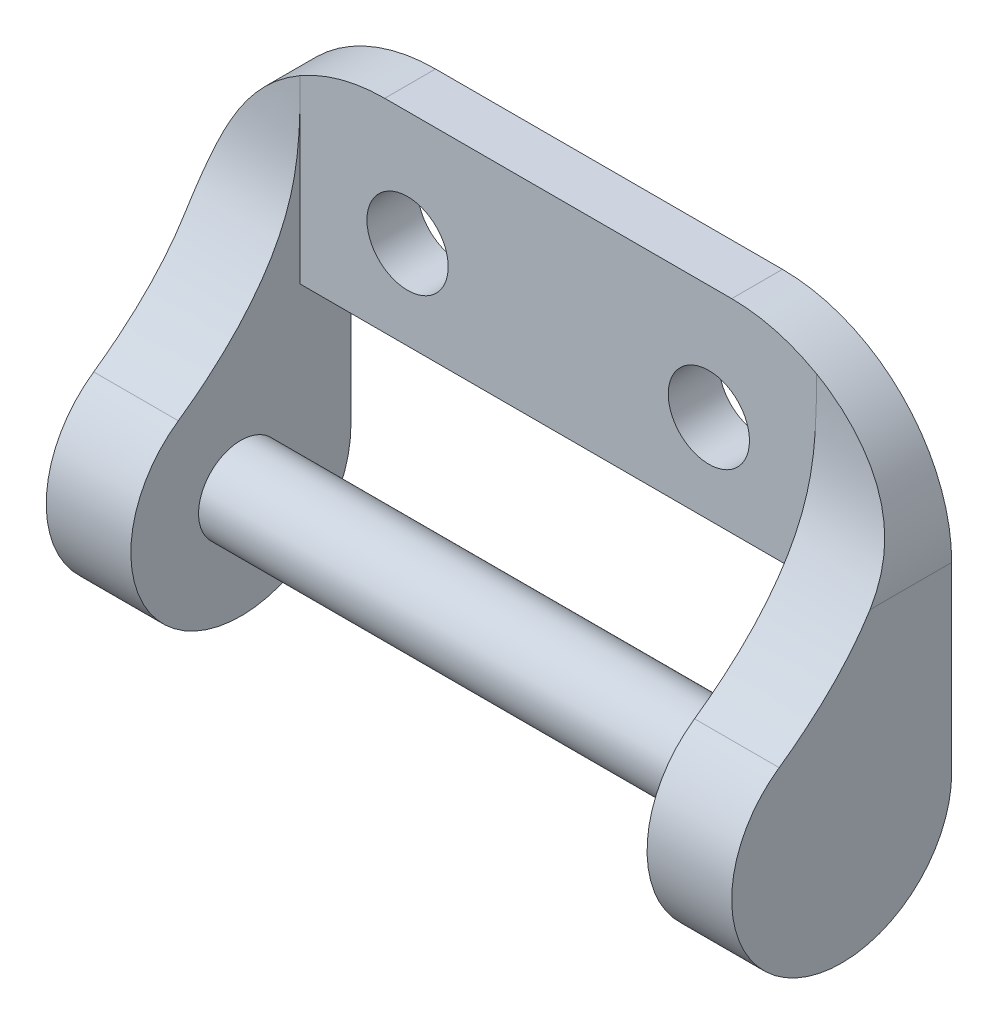
ISO-10303-21;
HEADER;
FILE_DESCRIPTION(('STEP AP214'),'2;1');
FILE_NAME('part.step','',(''),(''),'','','');
FILE_SCHEMA(('AUTOMOTIVE_DESIGN { 1 0 10303 214 1 1 1 1 }'));
ENDSEC;
DATA;
#1=APPLICATION_CONTEXT('core data for automotive mechanical design processes');
#2=APPLICATION_PROTOCOL_DEFINITION('international standard','automotive_design',2000,#1);
#3=PRODUCT_CONTEXT('',#1,'mechanical');
#4=PRODUCT('Part','Part','',(#3));
#5=PRODUCT_RELATED_PRODUCT_CATEGORY('part','',(#4));
#6=PRODUCT_DEFINITION_FORMATION('','',#4);
#7=PRODUCT_DEFINITION_CONTEXT('part definition',#1,'design');
#8=PRODUCT_DEFINITION('design','',#6,#7);
#9=PRODUCT_DEFINITION_SHAPE('','',#8);
#10=(LENGTH_UNIT() NAMED_UNIT(*) SI_UNIT(.MILLI.,.METRE.));
#11=(NAMED_UNIT(*) PLANE_ANGLE_UNIT() SI_UNIT($,.RADIAN.));
#12=(NAMED_UNIT(*) SI_UNIT($,.STERADIAN.) SOLID_ANGLE_UNIT());
#13=UNCERTAINTY_MEASURE_WITH_UNIT(LENGTH_MEASURE(1.E-05),#10,'distance_accuracy_value','');
#14=(GEOMETRIC_REPRESENTATION_CONTEXT(3) GLOBAL_UNCERTAINTY_ASSIGNED_CONTEXT((#13)) GLOBAL_UNIT_ASSIGNED_CONTEXT((#10,
#11,#12)) REPRESENTATION_CONTEXT('',''));
#15=CARTESIAN_POINT('',(0.,0.,0.));
#16=DIRECTION('',(0.,0.,1.));
#17=DIRECTION('',(1.,0.,0.));
#18=AXIS2_PLACEMENT_3D('',#15,#16,#17);
#19=CARTESIAN_POINT('',(0.,0.,3.));
#20=DIRECTION('',(0.,0.,1.));
#21=DIRECTION('',(1.,0.,0.));
#22=AXIS2_PLACEMENT_3D('',#19,#20,#21);
#23=PLANE('',#22);
#24=DIRECTION('',(-1.,0.,0.));
#25=VECTOR('',#24,1.);
#26=CARTESIAN_POINT('',(-15.25,6.,3.));
#27=LINE('',#26,#25);
#28=CARTESIAN_POINT('',(10.25,6.,3.));
#29=VERTEX_POINT('',#28);
#30=CARTESIAN_POINT('',(-10.25,6.,3.));
#31=VERTEX_POINT('',#30);
#32=EDGE_CURVE('E307',#29,#31,#27,.T.);
#33=ORIENTED_EDGE('',*,*,#32,.T.);
#34=CARTESIAN_POINT('',(-10.25,-4.,3.));
#35=DIRECTION('',(0.,0.,1.));
#36=DIRECTION('',(1.,0.,0.));
#37=AXIS2_PLACEMENT_3D('',#34,#35,#36);
#38=CIRCLE('',#37,10.);
#39=CARTESIAN_POINT('',(-15.25,4.66027729034637,2.99685095800352));
#40=VERTEX_POINT('',#39);
#41=EDGE_CURVE('E256',#31,#40,#38,.T.);
#42=ORIENTED_EDGE('',*,*,#41,.T.);
#43=CARTESIAN_POINT('',(-15.25,3.20847751480781,3.));
#44=CARTESIAN_POINT('',(-15.25,3.69449153895838,2.99106189528663));
#45=CARTESIAN_POINT('',(-15.25,4.1797681662503,2.99133644151458));
#46=CARTESIAN_POINT('',(-15.25,4.66029279210864,2.99370191600704));
#47=B_SPLINE_CURVE_WITH_KNOTS('',3,(#43,#44,#45,#46),.UNSPECIFIED.,.F.,.F.,(4,4),
(0.0760810905873373,0.156984166615158),.UNSPECIFIED.);
#48=CARTESIAN_POINT('',(-15.25,3.20847751480781,3.));
#49=VERTEX_POINT('',#48);
#50=EDGE_CURVE('E154',#40,#49,#47,.F.);
#51=ORIENTED_EDGE('',*,*,#50,.T.);
#52=DIRECTION('',(0.,-1.,0.));
#53=VECTOR('',#52,1.);
#54=CARTESIAN_POINT('',(-15.25,6.,3.));
#55=LINE('',#54,#53);
#56=CARTESIAN_POINT('',(-15.25,-6.,3.));
#57=VERTEX_POINT('',#56);
#58=EDGE_CURVE('E234',#49,#57,#55,.T.);
#59=ORIENTED_EDGE('',*,*,#58,.T.);
#60=DIRECTION('',(1.,0.,0.));
#61=VECTOR('',#60,1.);
#62=CARTESIAN_POINT('',(-15.25,-6.,3.));
#63=LINE('',#62,#61);
#64=CARTESIAN_POINT('',(15.25,-6.,3.));
#65=VERTEX_POINT('',#64);
#66=EDGE_CURVE('E328',#57,#65,#63,.T.);
#67=ORIENTED_EDGE('',*,*,#66,.T.);
#68=DIRECTION('',(0.,1.,0.));
#69=VECTOR('',#68,1.);
#70=CARTESIAN_POINT('',(15.25,6.,3.));
#71=LINE('',#70,#69);
#72=CARTESIAN_POINT('',(15.25,3.2084775148078,3.));
#73=VERTEX_POINT('',#72);
#74=EDGE_CURVE('E304',#65,#73,#71,.T.);
#75=ORIENTED_EDGE('',*,*,#74,.T.);
#76=CARTESIAN_POINT('',(15.25,4.66027727117929,2.99370183960303));
#77=CARTESIAN_POINT('',(15.25,4.17975771663876,2.99133643560376));
#78=CARTESIAN_POINT('',(15.25,3.69448630621336,2.99106199152011));
#79=CARTESIAN_POINT('',(15.25,3.2084775148078,3.));
#80=B_SPLINE_CURVE_WITH_KNOTS('',3,(#76,#77,#78,#79),.UNSPECIFIED.,.F.,.F.,(4,4),
(0.0760819616427952,0.156984166615158),.UNSPECIFIED.);
#81=CARTESIAN_POINT('',(15.25,4.66027727117929,2.99685091980152));
#82=VERTEX_POINT('',#81);
#83=EDGE_CURVE('E294',#82,#73,#80,.T.);
#84=ORIENTED_EDGE('',*,*,#83,.F.);
#85=CARTESIAN_POINT('',(10.25,-4.,3.));
#86=DIRECTION('',(0.,0.,1.));
#87=DIRECTION('',(1.,0.,0.));
#88=AXIS2_PLACEMENT_3D('',#85,#86,#87);
#89=CIRCLE('',#88,10.);
#90=EDGE_CURVE('E254',#82,#29,#89,.T.);
#91=ORIENTED_EDGE('',*,*,#90,.T.);
#92=EDGE_LOOP('',(#33,#42,#51,#59,#67,#75,#84,#91));
#93=FACE_BOUND('',#92,.T.);
#94=CARTESIAN_POINT('',(8.9,-0.750000000000002,3.));
#95=DIRECTION('',(0.,0.,1.));
#96=DIRECTION('',(1.,0.,0.));
#97=AXIS2_PLACEMENT_3D('',#94,#95,#96);
#98=CIRCLE('',#97,2.4);
#99=CARTESIAN_POINT('',(11.3,-0.750000000000002,3.));
#100=VERTEX_POINT('',#99);
#101=EDGE_CURVE('E502',#100,#100,#98,.T.);
#102=ORIENTED_EDGE('',*,*,#101,.F.);
#103=EDGE_LOOP('',(#102));
#104=FACE_BOUND('',#103,.T.);
#105=CARTESIAN_POINT('',(-8.9,-0.750000000000002,3.));
#106=DIRECTION('',(0.,0.,-1.));
#107=DIRECTION('',(-1.,0.,0.));
#108=AXIS2_PLACEMENT_3D('',#105,#106,#107);
#109=CIRCLE('',#108,2.4);
#110=CARTESIAN_POINT('',(-11.3,-0.750000000000002,3.));
#111=VERTEX_POINT('',#110);
#112=EDGE_CURVE('E506',#111,#111,#109,.T.);
#113=ORIENTED_EDGE('',*,*,#112,.T.);
#114=EDGE_LOOP('',(#113));
#115=FACE_BOUND('',#114,.T.);
#116=ADVANCED_FACE('F36',(#93,#104,#115),#23,.T.);
#117=CARTESIAN_POINT('',(0.,0.,0.));
#118=DIRECTION('',(0.,0.,1.));
#119=DIRECTION('',(1.,0.,0.));
#120=AXIS2_PLACEMENT_3D('',#117,#118,#119);
#121=PLANE('',#120);
#122=DIRECTION('',(0.,1.,0.));
#123=VECTOR('',#122,1.);
#124=CARTESIAN_POINT('',(-20.25,6.,0.));
#125=LINE('',#124,#123);
#126=CARTESIAN_POINT('',(-20.25,-14.75,0.));
#127=VERTEX_POINT('',#126);
#128=CARTESIAN_POINT('',(-20.25,-4.,0.));
#129=VERTEX_POINT('',#128);
#130=EDGE_CURVE('E136',#127,#129,#125,.T.);
#131=ORIENTED_EDGE('',*,*,#130,.T.);
#132=CARTESIAN_POINT('',(-10.25,-4.,0.));
#133=DIRECTION('',(0.,0.,1.));
#134=DIRECTION('',(1.,0.,0.));
#135=AXIS2_PLACEMENT_3D('',#132,#133,#134);
#136=CIRCLE('',#135,10.);
#137=CARTESIAN_POINT('',(-10.25,6.,0.));
#138=VERTEX_POINT('',#137);
#139=EDGE_CURVE('E262',#129,#138,#136,.F.);
#140=ORIENTED_EDGE('',*,*,#139,.T.);
#141=DIRECTION('',(-1.,0.,0.));
#142=VECTOR('',#141,1.);
#143=CARTESIAN_POINT('',(-15.25,6.,0.));
#144=LINE('',#143,#142);
#145=CARTESIAN_POINT('',(10.25,6.,0.));
#146=VERTEX_POINT('',#145);
#147=EDGE_CURVE('E338',#146,#138,#144,.T.);
#148=ORIENTED_EDGE('',*,*,#147,.F.);
#149=CARTESIAN_POINT('',(10.25,-4.,0.));
#150=DIRECTION('',(0.,0.,1.));
#151=DIRECTION('',(1.,0.,0.));
#152=AXIS2_PLACEMENT_3D('',#149,#150,#151);
#153=CIRCLE('',#152,10.);
#154=CARTESIAN_POINT('',(20.25,-4.,0.));
#155=VERTEX_POINT('',#154);
#156=EDGE_CURVE('E64',#146,#155,#153,.F.);
#157=ORIENTED_EDGE('',*,*,#156,.T.);
#158=DIRECTION('',(0.,1.,0.));
#159=VECTOR('',#158,1.);
#160=CARTESIAN_POINT('',(20.25,6.,0.));
#161=LINE('',#160,#159);
#162=CARTESIAN_POINT('',(20.25,-14.75,0.));
#163=VERTEX_POINT('',#162);
#164=EDGE_CURVE('E269',#163,#155,#161,.T.);
#165=ORIENTED_EDGE('',*,*,#164,.F.);
#166=DIRECTION('',(-1.,0.,0.));
#167=VECTOR('',#166,1.);
#168=CARTESIAN_POINT('',(20.25,-14.75,0.));
#169=LINE('',#168,#167);
#170=CARTESIAN_POINT('',(15.25,-14.75,0.));
#171=VERTEX_POINT('',#170);
#172=EDGE_CURVE('E292',#163,#171,#169,.T.);
#173=ORIENTED_EDGE('',*,*,#172,.T.);
#174=DIRECTION('',(0.,1.,0.));
#175=VECTOR('',#174,1.);
#176=CARTESIAN_POINT('',(15.25,6.,0.));
#177=LINE('',#176,#175);
#178=CARTESIAN_POINT('',(15.25,-6.,0.));
#179=VERTEX_POINT('',#178);
#180=EDGE_CURVE('E275',#171,#179,#177,.T.);
#181=ORIENTED_EDGE('',*,*,#180,.T.);
#182=DIRECTION('',(1.,0.,0.));
#183=VECTOR('',#182,1.);
#184=CARTESIAN_POINT('',(-15.25,-6.,0.));
#185=LINE('',#184,#183);
#186=CARTESIAN_POINT('',(-15.25,-6.,0.));
#187=VERTEX_POINT('',#186);
#188=EDGE_CURVE('E308',#187,#179,#185,.T.);
#189=ORIENTED_EDGE('',*,*,#188,.F.);
#190=DIRECTION('',(0.,1.,0.));
#191=VECTOR('',#190,1.);
#192=CARTESIAN_POINT('',(-15.25,6.,0.));
#193=LINE('',#192,#191);
#194=CARTESIAN_POINT('',(-15.25,-14.75,0.));
#195=VERTEX_POINT('',#194);
#196=EDGE_CURVE('E139',#195,#187,#193,.T.);
#197=ORIENTED_EDGE('',*,*,#196,.F.);
#198=DIRECTION('',(1.,0.,0.));
#199=VECTOR('',#198,1.);
#200=CARTESIAN_POINT('',(-20.25,-14.75,0.));
#201=LINE('',#200,#199);
#202=EDGE_CURVE('E132',#127,#195,#201,.T.);
#203=ORIENTED_EDGE('',*,*,#202,.F.);
#204=EDGE_LOOP('',(#131,#140,#148,#157,#165,#173,#181,#189,#197,#203));
#205=FACE_BOUND('',#204,.T.);
#206=CARTESIAN_POINT('',(8.9,-0.750000000000002,0.));
#207=DIRECTION('',(0.,0.,1.));
#208=DIRECTION('',(1.,0.,0.));
#209=AXIS2_PLACEMENT_3D('',#206,#207,#208);
#210=CIRCLE('',#209,2.4);
#211=CARTESIAN_POINT('',(11.3,-0.750000000000002,0.));
#212=VERTEX_POINT('',#211);
#213=EDGE_CURVE('E498',#212,#212,#210,.T.);
#214=ORIENTED_EDGE('',*,*,#213,.T.);
#215=EDGE_LOOP('',(#214));
#216=FACE_BOUND('',#215,.T.);
#217=CARTESIAN_POINT('',(-8.9,-0.750000000000002,0.));
#218=DIRECTION('',(0.,0.,1.));
#219=DIRECTION('',(1.,0.,0.));
#220=AXIS2_PLACEMENT_3D('',#217,#218,#219);
#221=CIRCLE('',#220,2.4);
#222=CARTESIAN_POINT('',(-6.5,-0.750000000000002,0.));
#223=VERTEX_POINT('',#222);
#224=EDGE_CURVE('E315',#223,#223,#221,.F.);
#225=ORIENTED_EDGE('',*,*,#224,.F.);
#226=EDGE_LOOP('',(#225));
#227=FACE_BOUND('',#226,.T.);
#228=ADVANCED_FACE('F134',(#205,#216,#227),#121,.F.);
#229=CARTESIAN_POINT('',(-15.25,6.,3.));
#230=DIRECTION('',(0.,-1.,0.));
#231=DIRECTION('',(0.,0.,-1.));
#232=AXIS2_PLACEMENT_3D('',#229,#230,#231);
#233=PLANE('',#232);
#234=ORIENTED_EDGE('',*,*,#147,.T.);
#235=DIRECTION('',(0.,0.,1.));
#236=VECTOR('',#235,1.);
#237=CARTESIAN_POINT('',(-10.25,6.,3.));
#238=LINE('',#237,#236);
#239=EDGE_CURVE('E257',#138,#31,#238,.T.);
#240=ORIENTED_EDGE('',*,*,#239,.T.);
#241=ORIENTED_EDGE('',*,*,#32,.F.);
#242=DIRECTION('',(0.,0.,1.));
#243=VECTOR('',#242,1.);
#244=CARTESIAN_POINT('',(10.25,6.,0.));
#245=LINE('',#244,#243);
#246=EDGE_CURVE('E316',#29,#146,#245,.F.);
#247=ORIENTED_EDGE('',*,*,#246,.T.);
#248=EDGE_LOOP('',(#234,#240,#241,#247));
#249=FACE_BOUND('',#248,.T.);
#250=ADVANCED_FACE('F205',(#249),#233,.F.);
#251=CARTESIAN_POINT('',(-15.25,-6.,3.));
#252=DIRECTION('',(0.,1.,0.));
#253=DIRECTION('',(0.,0.,1.));
#254=AXIS2_PLACEMENT_3D('',#251,#252,#253);
#255=PLANE('',#254);
#256=ORIENTED_EDGE('',*,*,#188,.T.);
#257=DIRECTION('',(0.,0.,-1.));
#258=VECTOR('',#257,1.);
#259=CARTESIAN_POINT('',(15.25,-6.,3.));
#260=LINE('',#259,#258);
#261=EDGE_CURVE('E332',#65,#179,#260,.T.);
#262=ORIENTED_EDGE('',*,*,#261,.F.);
#263=ORIENTED_EDGE('',*,*,#66,.F.);
#264=DIRECTION('',(0.,0.,-1.));
#265=VECTOR('',#264,1.);
#266=CARTESIAN_POINT('',(-15.25,-6.,3.));
#267=LINE('',#266,#265);
#268=EDGE_CURVE('E236',#57,#187,#267,.T.);
#269=ORIENTED_EDGE('',*,*,#268,.T.);
#270=EDGE_LOOP('',(#256,#262,#263,#269));
#271=FACE_BOUND('',#270,.T.);
#272=ADVANCED_FACE('F208',(#271),#255,.F.);
#273=CARTESIAN_POINT('',(20.25,-14.75,6.5));
#274=DIRECTION('',(1.,0.,0.));
#275=DIRECTION('',(0.,0.,-1.));
#276=AXIS2_PLACEMENT_3D('',#273,#274,#275);
#277=PLANE('',#276);
#278=ORIENTED_EDGE('',*,*,#164,.T.);
#279=DIRECTION('',(0.,0.,1.));
#280=VECTOR('',#279,1.);
#281=CARTESIAN_POINT('',(20.25,-4.,3.));
#282=LINE('',#281,#280);
#283=CARTESIAN_POINT('',(20.25,-3.9999999999565,4.825765816921));
#284=VERTEX_POINT('',#283);
#285=EDGE_CURVE('E51',#155,#284,#282,.T.);
#286=ORIENTED_EDGE('',*,*,#285,.T.);
#287=CARTESIAN_POINT('',(20.25,6.,3.));
#288=CARTESIAN_POINT('',(20.25,3.71417378894203,3.));
#289=CARTESIAN_POINT('',(20.25,-2.58574795689462,2.72193084321985));
#290=CARTESIAN_POINT('',(20.25,-7.19293944561058,7.05406101836184));
#291=CARTESIAN_POINT('',(20.25,-9.40235907409936,10.1949609642908));
#292=B_SPLINE_CURVE_WITH_KNOTS('',3,(#287,#288,#289,#290,#291),.UNSPECIFIED.,.F.,.F.,(4,1,4),
(0.,0.395119321808391,1.),.UNSPECIFIED.);
#293=CARTESIAN_POINT('',(20.25,-9.40235907409936,10.1949609642908));
#294=VERTEX_POINT('',#293);
#295=EDGE_CURVE('E267',#284,#294,#292,.T.);
#296=ORIENTED_EDGE('',*,*,#295,.T.);
#297=CARTESIAN_POINT('',(20.25,-14.75,6.5));
#298=DIRECTION('',(1.,0.,0.));
#299=DIRECTION('',(0.,0.,-1.));
#300=AXIS2_PLACEMENT_3D('',#297,#298,#299);
#301=CIRCLE('',#300,6.5);
#302=EDGE_CURVE('E274',#294,#163,#301,.T.);
#303=ORIENTED_EDGE('',*,*,#302,.T.);
#304=EDGE_LOOP('',(#278,#286,#296,#303));
#305=FACE_BOUND('',#304,.T.);
#306=ADVANCED_FACE('F212',(#305),#277,.T.);
#307=CARTESIAN_POINT('',(15.25,-14.75,6.5));
#308=DIRECTION('',(1.,0.,0.));
#309=DIRECTION('',(0.,0.,-1.));
#310=AXIS2_PLACEMENT_3D('',#307,#308,#309);
#311=PLANE('',#310);
#312=ORIENTED_EDGE('',*,*,#74,.F.);
#313=ORIENTED_EDGE('',*,*,#261,.T.);
#314=ORIENTED_EDGE('',*,*,#180,.F.);
#315=CARTESIAN_POINT('',(15.25,-14.75,6.5));
#316=DIRECTION('',(1.,0.,0.));
#317=DIRECTION('',(0.,0.,-1.));
#318=AXIS2_PLACEMENT_3D('',#315,#316,#317);
#319=CIRCLE('',#318,6.5);
#320=CARTESIAN_POINT('',(15.25,-9.40235907409936,10.1949609642908));
#321=VERTEX_POINT('',#320);
#322=EDGE_CURVE('E278',#321,#171,#319,.T.);
#323=ORIENTED_EDGE('',*,*,#322,.F.);
#324=CARTESIAN_POINT('',(15.25,6.,3.));
#325=CARTESIAN_POINT('',(15.25,3.71417378894203,3.));
#326=CARTESIAN_POINT('',(15.25,-2.58574795689462,2.72193084321985));
#327=CARTESIAN_POINT('',(15.25,-7.19293944561058,7.05406101836184));
#328=CARTESIAN_POINT('',(15.25,-9.40235907409936,10.1949609642908));
#329=B_SPLINE_CURVE_WITH_KNOTS('',3,(#324,#325,#326,#327,#328),.UNSPECIFIED.,.F.,.F.,(4,1,4),
(0.,0.395119321808391,1.),.UNSPECIFIED.);
#330=EDGE_CURVE('E144',#73,#321,#329,.T.);
#331=ORIENTED_EDGE('',*,*,#330,.F.);
#332=EDGE_LOOP('',(#312,#313,#314,#323,#331));
#333=FACE_BOUND('',#332,.T.);
#334=CARTESIAN_POINT('',(15.25,-14.75,6.5));
#335=DIRECTION('',(1.,0.,0.));
#336=DIRECTION('',(0.,0.,-1.));
#337=AXIS2_PLACEMENT_3D('',#334,#335,#336);
#338=CIRCLE('',#337,2.5);
#339=CARTESIAN_POINT('',(15.25,-14.75,4.));
#340=VERTEX_POINT('',#339);
#341=EDGE_CURVE('E509',#340,#340,#338,.T.);
#342=ORIENTED_EDGE('',*,*,#341,.T.);
#343=EDGE_LOOP('',(#342));
#344=FACE_BOUND('',#343,.T.);
#345=ADVANCED_FACE('F322',(#333,#344),#311,.F.);
#346=DIRECTION('',(-1.,0.,0.));
#347=VECTOR('',#346,1.);
#348=SURFACE_OF_LINEAR_EXTRUSION('',#292,#347);
#349=ORIENTED_EDGE('',*,*,#295,.F.);
#350=CARTESIAN_POINT('',(20.25,-4.,4.82576581684921));
#351=CARTESIAN_POINT('',(20.2500014838274,-3.86866761266286,4.74455882863275));
#352=CARTESIAN_POINT('',(20.2474126417045,-3.73587564646821,4.66567134476372));
#353=CARTESIAN_POINT('',(20.2367148341825,-3.46747572261044,4.5128237806115));
#354=CARTESIAN_POINT('',(20.2285986182353,-3.33186429330742,4.43887031261123));
#355=CARTESIAN_POINT('',(20.2065004699935,-3.05822131620742,4.29636657931706));
#356=CARTESIAN_POINT('',(20.1925162244947,-2.92018883460445,4.22781845750803));
#357=CARTESIAN_POINT('',(20.1584857525011,-2.64306714813446,4.09696035251606));
#358=CARTESIAN_POINT('',(20.1384806604646,-2.50399116914045,4.03461174336836));
#359=CARTESIAN_POINT('',(20.0921165059368,-2.22438301764909,3.91597325642219));
#360=CARTESIAN_POINT('',(20.0657599907388,-2.08385145049758,3.85968096274454));
#361=CARTESIAN_POINT('',(20.0064763428021,-1.80183634614827,3.7533970489132));
#362=CARTESIAN_POINT('',(19.9735509958771,-1.66035307776115,3.70340372232532));
#363=CARTESIAN_POINT('',(19.9007436387173,-1.37610904825775,3.60957064849247));
#364=CARTESIAN_POINT('',(19.8608201258698,-1.23334577930557,3.56577059991134));
#365=CARTESIAN_POINT('',(19.7740509070323,-0.948002267510542,3.48481609047451));
#366=CARTESIAN_POINT('',(19.7272036138346,-0.805422074215585,3.44766315773217));
#367=CARTESIAN_POINT('',(19.6266147715725,-0.521233015588115,3.37948171526153));
#368=CARTESIAN_POINT('',(19.5728728529367,-0.379624202753298,3.34845353406364));
#369=CARTESIAN_POINT('',(19.4585585063444,-0.0980057062598591,3.29181654188834));
#370=CARTESIAN_POINT('',(19.397982392115,0.042003069090794,3.26621067726351));
#371=CARTESIAN_POINT('',(19.2701562986383,0.319739363776992,3.21978845304765));
#372=CARTESIAN_POINT('',(19.2029065313257,0.457466955393938,3.19897194143112));
#373=CARTESIAN_POINT('',(19.0619003233115,0.730113651998097,3.16149371324954));
#374=CARTESIAN_POINT('',(18.9881439279995,0.865032776568839,3.14483196770428));
#375=CARTESIAN_POINT('',(18.7981982053359,1.19417065611321,3.1080789378229));
#376=CARTESIAN_POINT('',(18.6783355388616,1.38651349556201,3.09004603778));
#377=CARTESIAN_POINT('',(18.4255747112276,1.76293332545359,3.0599442154597));
#378=CARTESIAN_POINT('',(18.2926744018287,1.94700894638089,3.0478762780262));
#379=CARTESIAN_POINT('',(18.014488991606,2.30589215745114,3.02823148130383));
#380=CARTESIAN_POINT('',(17.8691997646194,2.48069662812449,3.02065612501625));
#381=CARTESIAN_POINT('',(17.566989775926,2.82006432790395,3.00876194119975));
#382=CARTESIAN_POINT('',(17.4100694008335,2.98462789707913,3.00444300548206));
#383=CARTESIAN_POINT('',(17.1478456215039,3.2414977761545,2.99928111558957));
#384=CARTESIAN_POINT('',(17.0459046360886,3.33725002264349,2.99774013674774));
#385=CARTESIAN_POINT('',(16.8380930347588,3.5243988208455,2.9953149068214));
#386=CARTESIAN_POINT('',(16.7322225971594,3.61579556977844,2.99443062597466));
#387=CARTESIAN_POINT('',(16.5167428463526,3.79406750943485,2.99314939605854));
#388=CARTESIAN_POINT('',(16.4071335843463,3.88094276203643,2.99275244031829));
#389=CARTESIAN_POINT('',(16.1845608492086,4.04987409660681,2.99230500327614));
#390=CARTESIAN_POINT('',(16.071603525154,4.13193827780459,2.99225392207559));
#391=CARTESIAN_POINT('',(15.8423502519162,4.291266621813,2.99237920761913));
#392=CARTESIAN_POINT('',(15.7260542438083,4.36853069982988,2.99255557837996));
#393=CARTESIAN_POINT('',(15.4903266812117,4.51812615907911,2.99304691740808));
#394=CARTESIAN_POINT('',(15.3708950226506,4.59045737630236,2.99336189028105));
#395=CARTESIAN_POINT('',(15.25,4.66025403784438,2.99370172523634));
#396=B_SPLINE_CURVE_WITH_KNOTS('',3,(#350,#351,#352,#353,#354,#355,#356,#357,#358,#359,#360,
#361,#362,#363,#364,#365,#366,#367,#368,#369,#370,#371,#372,#373,#374,#375,#376,#377,#378,#379,
#380,#381,#382,#383,#384,#385,#386,#387,#388,#389,#390,#391,#392,#393,#394,#395),.UNSPECIFIED.,
.F.,.F.,(4,2,2,2,2,2,2,2,2,2,2,2,2,2,2,2,2,2,2,2,2,2,4),(0.,0.46321931474474,0.927047432082894,
1.39105856460255,1.85196888387349,2.31269465780609,2.77329534830891,3.23672623402247,
3.70026352190033,4.16382566707102,4.6276390577362,5.09143772382424,5.55523315474566,
6.23662100614083,6.91812132038679,7.59984950338505,8.28155503617901,8.7010461378021,
9.12051822649772,9.53998457307425,9.95872319363602,10.377469209107,10.7962291403781),.UNSPECIFIED.);
#397=EDGE_CURVE('E11',#284,#82,#396,.T.);
#398=ORIENTED_EDGE('',*,*,#397,.T.);
#399=ORIENTED_EDGE('',*,*,#83,.T.);
#400=ORIENTED_EDGE('',*,*,#330,.T.);
#401=DIRECTION('',(-1.,0.,0.));
#402=VECTOR('',#401,1.);
#403=CARTESIAN_POINT('',(20.25,-9.40235907409936,10.1949609642908));
#404=LINE('',#403,#402);
#405=EDGE_CURVE('E272',#294,#321,#404,.T.);
#406=ORIENTED_EDGE('',*,*,#405,.F.);
#407=EDGE_LOOP('',(#349,#398,#399,#400,#406));
#408=FACE_BOUND('',#407,.T.);
#409=ADVANCED_FACE('F219',(#408),#348,.F.);
#410=CARTESIAN_POINT('',(20.25,-14.75,6.5));
#411=DIRECTION('',(-1.,0.,0.));
#412=DIRECTION('',(0.,0.,1.));
#413=AXIS2_PLACEMENT_3D('',#410,#411,#412);
#414=CYLINDRICAL_SURFACE('',#413,6.5);
#415=ORIENTED_EDGE('',*,*,#322,.T.);
#416=ORIENTED_EDGE('',*,*,#172,.F.);
#417=ORIENTED_EDGE('',*,*,#302,.F.);
#418=ORIENTED_EDGE('',*,*,#405,.T.);
#419=EDGE_LOOP('',(#415,#416,#417,#418));
#420=FACE_BOUND('',#419,.T.);
#421=ADVANCED_FACE('F352',(#420),#414,.T.);
#422=CARTESIAN_POINT('',(-20.25,-14.75,6.5));
#423=DIRECTION('',(1.,0.,0.));
#424=DIRECTION('',(0.,0.,-1.));
#425=AXIS2_PLACEMENT_3D('',#422,#423,#424);
#426=CYLINDRICAL_SURFACE('',#425,6.5);
#427=CARTESIAN_POINT('',(-15.25,-14.75,6.5));
#428=DIRECTION('',(1.,0.,0.));
#429=DIRECTION('',(0.,0.,-1.));
#430=AXIS2_PLACEMENT_3D('',#427,#428,#429);
#431=CIRCLE('',#430,6.5);
#432=CARTESIAN_POINT('',(-15.25,-9.40235907409936,10.1949609642908));
#433=VERTEX_POINT('',#432);
#434=EDGE_CURVE('E499',#433,#195,#431,.T.);
#435=ORIENTED_EDGE('',*,*,#434,.F.);
#436=DIRECTION('',(1.,0.,0.));
#437=VECTOR('',#436,1.);
#438=CARTESIAN_POINT('',(-20.25,-9.40235907409936,10.1949609642908));
#439=LINE('',#438,#437);
#440=CARTESIAN_POINT('',(-20.25,-9.40235907409936,10.1949609642908));
#441=VERTEX_POINT('',#440);
#442=EDGE_CURVE('E145',#441,#433,#439,.T.);
#443=ORIENTED_EDGE('',*,*,#442,.F.);
#444=CARTESIAN_POINT('',(-20.25,-14.75,6.5));
#445=DIRECTION('',(1.,0.,0.));
#446=DIRECTION('',(0.,0.,-1.));
#447=AXIS2_PLACEMENT_3D('',#444,#445,#446);
#448=CIRCLE('',#447,6.5);
#449=EDGE_CURVE('E151',#441,#127,#448,.T.);
#450=ORIENTED_EDGE('',*,*,#449,.T.);
#451=ORIENTED_EDGE('',*,*,#202,.T.);
#452=EDGE_LOOP('',(#435,#443,#450,#451));
#453=FACE_BOUND('',#452,.T.);
#454=ADVANCED_FACE('F157',(#453),#426,.T.);
#455=CARTESIAN_POINT('',(-20.25,6.,3.));
#456=CARTESIAN_POINT('',(-20.25,3.71417378894203,3.));
#457=CARTESIAN_POINT('',(-20.25,-2.58574795689462,2.72193084321985));
#458=CARTESIAN_POINT('',(-20.25,-7.19293944561058,7.05406101836184));
#459=CARTESIAN_POINT('',(-20.25,-9.40235907409936,10.1949609642908));
#460=B_SPLINE_CURVE_WITH_KNOTS('',3,(#455,#456,#457,#458,#459),.UNSPECIFIED.,.F.,.F.,(4,1,4),
(0.,0.395119321808391,1.),.UNSPECIFIED.);
#461=DIRECTION('',(1.,0.,0.));
#462=VECTOR('',#461,1.);
#463=SURFACE_OF_LINEAR_EXTRUSION('',#460,#462);
#464=ORIENTED_EDGE('',*,*,#50,.F.);
#465=CARTESIAN_POINT('',(-15.249986575301,4.66026178858411,2.99370176338919));
#466=CARTESIAN_POINT('',(-15.4089250504233,4.56850531212282,2.9932615957662));
#467=CARTESIAN_POINT('',(-15.5653320194295,4.47236424664196,2.99285460608671));
#468=CARTESIAN_POINT('',(-15.8726314315945,4.27161841998906,2.99232927516519));
#469=CARTESIAN_POINT('',(-16.0235235237579,4.16701312146629,2.99221095226401));
#470=CARTESIAN_POINT('',(-16.3193254253216,3.94965305891197,2.99248536365864));
#471=CARTESIAN_POINT('',(-16.4642350699747,3.83689807068576,2.99287811201886));
#472=CARTESIAN_POINT('',(-16.7484281288322,3.60292691024196,2.994490849667));
#473=CARTESIAN_POINT('',(-16.8876751297205,3.48166653251201,2.99571550024209));
#474=CARTESIAN_POINT('',(-17.1592315612496,3.23163762074223,2.9993895852012));
#475=CARTESIAN_POINT('',(-17.2915412458033,3.10286936186335,3.00183897472391));
#476=CARTESIAN_POINT('',(-17.5488116538007,2.83823097902908,3.00844403697553));
#477=CARTESIAN_POINT('',(-17.6737724360602,2.70236091192845,3.01259969604643));
#478=CARTESIAN_POINT('',(-17.9161372655573,2.42374381413934,3.02320033981858));
#479=CARTESIAN_POINT('',(-18.0335290455906,2.28098624437726,3.02964893574865));
#480=CARTESIAN_POINT('',(-18.2601550333816,1.98928446223653,3.04551117050036));
#481=CARTESIAN_POINT('',(-18.3693890446018,1.84034010093982,3.05492488072919));
#482=CARTESIAN_POINT('',(-18.5793371330214,1.53680396660216,3.07749828405956));
#483=CARTESIAN_POINT('',(-18.6800502077834,1.38221153215372,3.09065841711271));
#484=CARTESIAN_POINT('',(-18.8722594180558,1.06856532100845,3.1215546367676));
#485=CARTESIAN_POINT('',(-18.963785890825,0.909528605945888,3.139274923344));
#486=CARTESIAN_POINT('',(-19.1376804021985,0.587227910695719,3.18028350722188));
#487=CARTESIAN_POINT('',(-19.2200491774965,0.423964271848819,3.20357135616368));
#488=CARTESIAN_POINT('',(-19.3753361567201,0.0940771466741472,3.25676589593669));
#489=CARTESIAN_POINT('',(-19.448255853967,-0.0725458039302709,3.28667153887172));
#490=CARTESIAN_POINT('',(-19.5800358642025,-0.397345043741829,3.3520407449293));
#491=CARTESIAN_POINT('',(-19.6394999153451,-0.555372185325888,3.3870208561144));
#492=CARTESIAN_POINT('',(-19.7222560813012,-0.793222724045279,3.44524535091976));
#493=CARTESIAN_POINT('',(-19.748769563599,-0.872646047542662,3.46561397982746));
#494=CARTESIAN_POINT('',(-19.7996468316108,-1.03163144934937,3.50839127145417));
#495=CARTESIAN_POINT('',(-19.8240106209277,-1.11119352742591,3.53079993075391));
#496=CARTESIAN_POINT('',(-19.8938825920211,-1.34990426315496,3.60110797015785));
#497=CARTESIAN_POINT('',(-19.936180806329,-1.50910461136037,3.65209601799383));
#498=CARTESIAN_POINT('',(-20.0123498152922,-1.82670664254096,3.76212896643549));
#499=CARTESIAN_POINT('',(-20.0462208705092,-1.98510835006116,3.82117361784918));
#500=CARTESIAN_POINT('',(-20.1058087710504,-2.30036193980872,3.94704134230298));
#501=CARTESIAN_POINT('',(-20.1315247943366,-2.45721366425276,4.01386519856975));
#502=CARTESIAN_POINT('',(-20.175136210809,-2.76858738305777,4.15484235204864));
#503=CARTESIAN_POINT('',(-20.1930355181604,-2.92311050593593,4.22899195808075));
#504=CARTESIAN_POINT('',(-20.2218491705782,-3.23368931731012,4.38636876559338));
#505=CARTESIAN_POINT('',(-20.2325508684723,-3.3896640456734,4.46979386575096));
#506=CARTESIAN_POINT('',(-20.2466168710013,-3.69772619995346,4.64306984222538));
#507=CARTESIAN_POINT('',(-20.2500032381256,-3.84982394344366,4.7329005507175));
#508=CARTESIAN_POINT('',(-20.25,-3.99999999996192,4.82576581692436));
#509=B_SPLINE_CURVE_WITH_KNOTS('',3,(#465,#466,#467,#468,#469,#470,#471,#472,#473,#474,#475,
#476,#477,#478,#479,#480,#481,#482,#483,#484,#485,#486,#487,#488,#489,#490,#491,#492,#493,#494,
#495,#496,#497,#498,#499,#500,#501,#502,#503,#504,#505,#506,#507,#508),.UNSPECIFIED.,.F.,.F.,(4,
2,2,2,2,2,2,2,2,2,2,2,2,2,2,2,2,2,2,2,2,4),(0.,0.550500791555436,1.10103655904269,
1.65158747731302,2.20524895035326,2.75889014465363,3.31252690736201,3.86703950303234,
4.42156545374241,4.97615655067647,5.52885138131745,6.08150171804121,6.63406460775235,
7.15095485378679,7.40943131859317,7.6679073501776,8.18477102589894,8.70161871856906,
9.21851849362743,9.73515913716332,10.2664618745287,10.7961599924902),.UNSPECIFIED.);
#510=CARTESIAN_POINT('',(-20.25,-3.9999999999565,4.825765816921));
#511=VERTEX_POINT('',#510);
#512=EDGE_CURVE('E196',#40,#511,#509,.T.);
#513=ORIENTED_EDGE('',*,*,#512,.T.);
#514=EDGE_CURVE('E159',#511,#441,#460,.T.);
#515=ORIENTED_EDGE('',*,*,#514,.T.);
#516=ORIENTED_EDGE('',*,*,#442,.T.);
#517=CARTESIAN_POINT('',(-15.25,6.,3.));
#518=CARTESIAN_POINT('',(-15.25,3.71417378894203,3.));
#519=CARTESIAN_POINT('',(-15.25,-2.58574795689462,2.72193084321985));
#520=CARTESIAN_POINT('',(-15.25,-7.19293944561058,7.05406101836184));
#521=CARTESIAN_POINT('',(-15.25,-9.40235907409936,10.1949609642908));
#522=B_SPLINE_CURVE_WITH_KNOTS('',3,(#517,#518,#519,#520,#521),.UNSPECIFIED.,.F.,.F.,(4,1,4),
(0.,0.395119321808391,1.),.UNSPECIFIED.);
#523=EDGE_CURVE('E522',#49,#433,#522,.T.);
#524=ORIENTED_EDGE('',*,*,#523,.F.);
#525=EDGE_LOOP('',(#464,#513,#515,#516,#524));
#526=FACE_BOUND('',#525,.T.);
#527=ADVANCED_FACE('F173',(#526),#463,.T.);
#528=CARTESIAN_POINT('',(-20.25,-14.75,6.5));
#529=DIRECTION('',(-1.,0.,0.));
#530=DIRECTION('',(0.,0.,-1.));
#531=AXIS2_PLACEMENT_3D('',#528,#529,#530);
#532=PLANE('',#531);
#533=ORIENTED_EDGE('',*,*,#514,.F.);
#534=DIRECTION('',(0.,0.,1.));
#535=VECTOR('',#534,1.);
#536=CARTESIAN_POINT('',(-20.25,-4.,0.));
#537=LINE('',#536,#535);
#538=EDGE_CURVE('E153',#511,#129,#537,.F.);
#539=ORIENTED_EDGE('',*,*,#538,.T.);
#540=ORIENTED_EDGE('',*,*,#130,.F.);
#541=ORIENTED_EDGE('',*,*,#449,.F.);
#542=EDGE_LOOP('',(#533,#539,#540,#541));
#543=FACE_BOUND('',#542,.T.);
#544=ADVANCED_FACE('F150',(#543),#532,.T.);
#545=CARTESIAN_POINT('',(-15.25,-14.75,6.5));
#546=DIRECTION('',(-1.,0.,0.));
#547=DIRECTION('',(0.,0.,-1.));
#548=AXIS2_PLACEMENT_3D('',#545,#546,#547);
#549=PLANE('',#548);
#550=ORIENTED_EDGE('',*,*,#268,.F.);
#551=ORIENTED_EDGE('',*,*,#58,.F.);
#552=ORIENTED_EDGE('',*,*,#523,.T.);
#553=ORIENTED_EDGE('',*,*,#434,.T.);
#554=ORIENTED_EDGE('',*,*,#196,.T.);
#555=EDGE_LOOP('',(#550,#551,#552,#553,#554));
#556=FACE_BOUND('',#555,.T.);
#557=CARTESIAN_POINT('',(-15.25,-14.75,6.5));
#558=DIRECTION('',(1.,0.,0.));
#559=DIRECTION('',(0.,0.,-1.));
#560=AXIS2_PLACEMENT_3D('',#557,#558,#559);
#561=CIRCLE('',#560,2.5);
#562=CARTESIAN_POINT('',(-15.25,-14.75,4.));
#563=VERTEX_POINT('',#562);
#564=EDGE_CURVE('E497',#563,#563,#561,.T.);
#565=ORIENTED_EDGE('',*,*,#564,.F.);
#566=EDGE_LOOP('',(#565));
#567=FACE_BOUND('',#566,.T.);
#568=ADVANCED_FACE('F179',(#556,#567),#549,.F.);
#569=CARTESIAN_POINT('',(8.9,-0.750000000000002,-2.));
#570=DIRECTION('',(0.,0.,1.));
#571=DIRECTION('',(1.,0.,0.));
#572=AXIS2_PLACEMENT_3D('',#569,#570,#571);
#573=CYLINDRICAL_SURFACE('',#572,2.4);
#574=ORIENTED_EDGE('',*,*,#101,.T.);
#575=EDGE_LOOP('',(#574));
#576=FACE_BOUND('',#575,.T.);
#577=ORIENTED_EDGE('',*,*,#213,.F.);
#578=EDGE_LOOP('',(#577));
#579=FACE_BOUND('',#578,.T.);
#580=ADVANCED_FACE('F423',(#576,#579),#573,.F.);
#581=CARTESIAN_POINT('',(-8.9,-0.750000000000002,-2.));
#582=DIRECTION('',(0.,0.,1.));
#583=DIRECTION('',(1.,0.,0.));
#584=AXIS2_PLACEMENT_3D('',#581,#582,#583);
#585=CYLINDRICAL_SURFACE('',#584,2.4);
#586=ORIENTED_EDGE('',*,*,#112,.F.);
#587=EDGE_LOOP('',(#586));
#588=FACE_BOUND('',#587,.T.);
#589=ORIENTED_EDGE('',*,*,#224,.T.);
#590=EDGE_LOOP('',(#589));
#591=FACE_BOUND('',#590,.T.);
#592=ADVANCED_FACE('F415',(#588,#591),#585,.F.);
#593=CARTESIAN_POINT('',(20.25,-14.75,6.5));
#594=DIRECTION('',(-1.,0.,0.));
#595=DIRECTION('',(0.,0.,1.));
#596=AXIS2_PLACEMENT_3D('',#593,#594,#595);
#597=CYLINDRICAL_SURFACE('',#596,2.5);
#598=ORIENTED_EDGE('',*,*,#564,.T.);
#599=EDGE_LOOP('',(#598));
#600=FACE_BOUND('',#599,.T.);
#601=ORIENTED_EDGE('',*,*,#341,.F.);
#602=EDGE_LOOP('',(#601));
#603=FACE_BOUND('',#602,.T.);
#604=ADVANCED_FACE('F203',(#600,#603),#597,.T.);
#605=CARTESIAN_POINT('',(-10.25,-4.,3.));
#606=DIRECTION('',(0.,0.,-1.));
#607=DIRECTION('',(-1.,0.,0.));
#608=AXIS2_PLACEMENT_3D('',#605,#606,#607);
#609=CYLINDRICAL_SURFACE('',#608,10.);
#610=ORIENTED_EDGE('',*,*,#139,.F.);
#611=ORIENTED_EDGE('',*,*,#538,.F.);
#612=ORIENTED_EDGE('',*,*,#512,.F.);
#613=ORIENTED_EDGE('',*,*,#41,.F.);
#614=ORIENTED_EDGE('',*,*,#239,.F.);
#615=EDGE_LOOP('',(#610,#611,#612,#613,#614));
#616=FACE_BOUND('',#615,.T.);
#617=ADVANCED_FACE('F199',(#616),#609,.T.);
#618=CARTESIAN_POINT('',(10.25,-4.,6.5));
#619=DIRECTION('',(0.,0.,-1.));
#620=DIRECTION('',(-1.,0.,0.));
#621=AXIS2_PLACEMENT_3D('',#618,#619,#620);
#622=CYLINDRICAL_SURFACE('',#621,10.);
#623=ORIENTED_EDGE('',*,*,#156,.F.);
#624=ORIENTED_EDGE('',*,*,#246,.F.);
#625=ORIENTED_EDGE('',*,*,#90,.F.);
#626=ORIENTED_EDGE('',*,*,#397,.F.);
#627=ORIENTED_EDGE('',*,*,#285,.F.);
#628=EDGE_LOOP('',(#623,#624,#625,#626,#627));
#629=FACE_BOUND('',#628,.T.);
#630=ADVANCED_FACE('F38',(#629),#622,.T.);
#631=CLOSED_SHELL('',(#116,#228,#250,#272,#306,#345,#409,#421,#454,#527,#544,#568,#580,#592,
#604,#617,#630));
#632=MANIFOLD_SOLID_BREP('B2',#631);
#633=ADVANCED_BREP_SHAPE_REPRESENTATION('',(#18,#632),#14);
#634=SHAPE_DEFINITION_REPRESENTATION(#9,#633);
ENDSEC;
END-ISO-10303-21;
